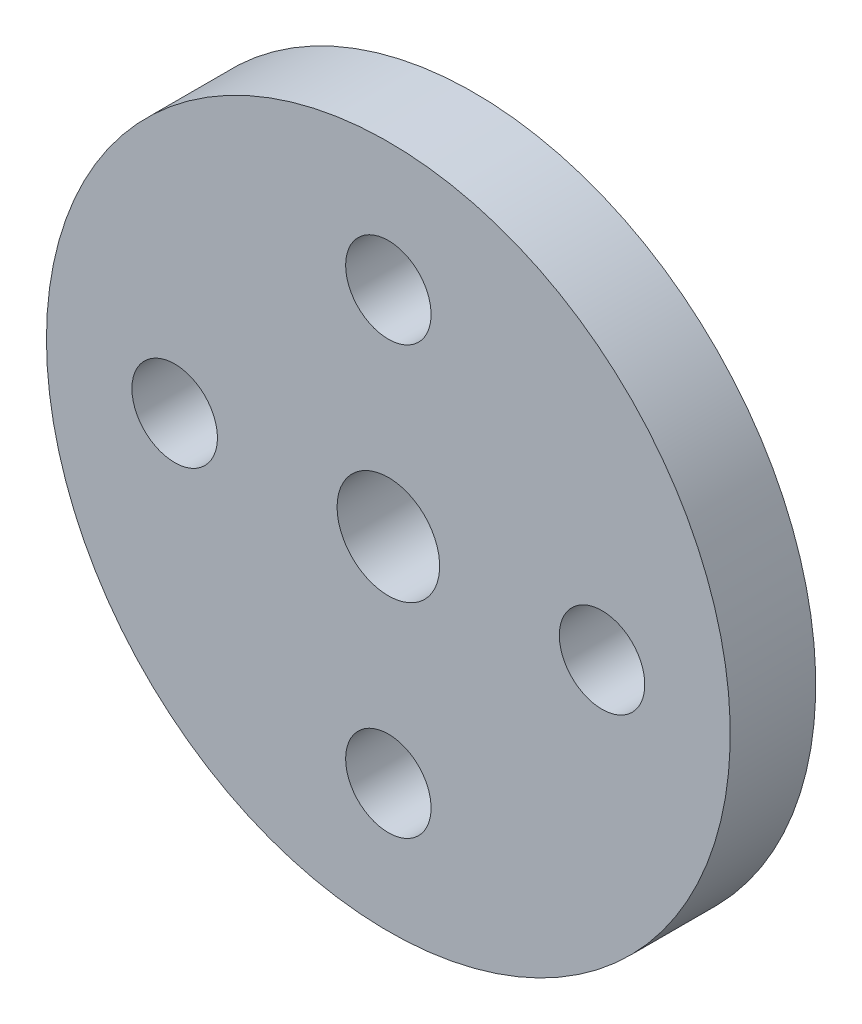
ISO-10303-21;
HEADER;
FILE_DESCRIPTION(('STEP AP214'),'2;1');
FILE_NAME('part.step','',(''),(''),'','','');
FILE_SCHEMA(('AUTOMOTIVE_DESIGN { 1 0 10303 214 1 1 1 1 }'));
ENDSEC;
DATA;
#1=APPLICATION_CONTEXT('core data for automotive mechanical design processes');
#2=APPLICATION_PROTOCOL_DEFINITION('international standard','automotive_design',2000,#1);
#3=PRODUCT_CONTEXT('',#1,'mechanical');
#4=PRODUCT('Part','Part','',(#3));
#5=PRODUCT_RELATED_PRODUCT_CATEGORY('part','',(#4));
#6=PRODUCT_DEFINITION_FORMATION('','',#4);
#7=PRODUCT_DEFINITION_CONTEXT('part definition',#1,'design');
#8=PRODUCT_DEFINITION('design','',#6,#7);
#9=PRODUCT_DEFINITION_SHAPE('','',#8);
#10=(LENGTH_UNIT() NAMED_UNIT(*) SI_UNIT(.MILLI.,.METRE.));
#11=(NAMED_UNIT(*) PLANE_ANGLE_UNIT() SI_UNIT($,.RADIAN.));
#12=(NAMED_UNIT(*) SI_UNIT($,.STERADIAN.) SOLID_ANGLE_UNIT());
#13=UNCERTAINTY_MEASURE_WITH_UNIT(LENGTH_MEASURE(1.E-05),#10,'distance_accuracy_value','');
#14=(GEOMETRIC_REPRESENTATION_CONTEXT(3) GLOBAL_UNCERTAINTY_ASSIGNED_CONTEXT((#13)) GLOBAL_UNIT_ASSIGNED_CONTEXT((#10,
#11,#12)) REPRESENTATION_CONTEXT('',''));
#15=CARTESIAN_POINT('',(0.,0.,0.));
#16=DIRECTION('',(0.,0.,1.));
#17=DIRECTION('',(1.,0.,0.));
#18=AXIS2_PLACEMENT_3D('',#15,#16,#17);
#19=CARTESIAN_POINT('',(0.,0.,0.));
#20=DIRECTION('',(0.,0.,1.));
#21=DIRECTION('',(1.,0.,0.));
#22=AXIS2_PLACEMENT_3D('',#19,#20,#21);
#23=PLANE('',#22);
#24=DIRECTION('',(0.,1.,0.));
#25=VECTOR('',#24,1.);
#26=CARTESIAN_POINT('',(3.,1.5,0.));
#27=LINE('',#26,#25);
#28=CARTESIAN_POINT('',(3.,0.,0.));
#29=VERTEX_POINT('',#28);
#30=CARTESIAN_POINT('',(3.,3.,0.));
#31=VERTEX_POINT('',#30);
#32=EDGE_CURVE('E326',#29,#31,#27,.T.);
#33=ORIENTED_EDGE('',*,*,#32,.T.);
#34=DIRECTION('',(1.,0.,0.));
#35=VECTOR('',#34,1.);
#36=CARTESIAN_POINT('',(2.15421099245176,3.,0.));
#37=LINE('',#36,#35);
#38=CARTESIAN_POINT('',(4.30842198490352,3.,0.));
#39=VERTEX_POINT('',#38);
#40=EDGE_CURVE('E259',#31,#39,#37,.T.);
#41=ORIENTED_EDGE('',*,*,#40,.T.);
#42=CARTESIAN_POINT('',(0.,0.,0.));
#43=DIRECTION('',(0.,0.,1.));
#44=DIRECTION('',(1.,0.,0.));
#45=AXIS2_PLACEMENT_3D('',#42,#43,#44);
#46=CIRCLE('',#45,5.25);
#47=CARTESIAN_POINT('',(-4.30842198490352,3.,0.));
#48=VERTEX_POINT('',#47);
#49=EDGE_CURVE('E294',#39,#48,#46,.T.);
#50=ORIENTED_EDGE('',*,*,#49,.T.);
#51=DIRECTION('',(1.,0.,0.));
#52=VECTOR('',#51,1.);
#53=CARTESIAN_POINT('',(-1.5,3.,0.));
#54=LINE('',#53,#52);
#55=CARTESIAN_POINT('',(-3.,3.,0.));
#56=VERTEX_POINT('',#55);
#57=EDGE_CURVE('E313',#48,#56,#54,.T.);
#58=ORIENTED_EDGE('',*,*,#57,.T.);
#59=DIRECTION('',(0.,-1.,0.));
#60=VECTOR('',#59,1.);
#61=CARTESIAN_POINT('',(-3.,0.,0.));
#62=LINE('',#61,#60);
#63=CARTESIAN_POINT('',(-3.,0.,0.));
#64=VERTEX_POINT('',#63);
#65=EDGE_CURVE('E250',#56,#64,#62,.T.);
#66=ORIENTED_EDGE('',*,*,#65,.T.);
#67=DIRECTION('',(0.,-1.,0.));
#68=VECTOR('',#67,1.);
#69=CARTESIAN_POINT('',(-3.,-1.5,0.));
#70=LINE('',#69,#68);
#71=CARTESIAN_POINT('',(-3.,-3.,0.));
#72=VERTEX_POINT('',#71);
#73=EDGE_CURVE('E212',#64,#72,#70,.T.);
#74=ORIENTED_EDGE('',*,*,#73,.T.);
#75=DIRECTION('',(-1.,0.,0.));
#76=VECTOR('',#75,1.);
#77=CARTESIAN_POINT('',(-2.15421099245176,-3.,0.));
#78=LINE('',#77,#76);
#79=CARTESIAN_POINT('',(-4.30842198490352,-3.,0.));
#80=VERTEX_POINT('',#79);
#81=EDGE_CURVE('E237',#72,#80,#78,.T.);
#82=ORIENTED_EDGE('',*,*,#81,.T.);
#83=CARTESIAN_POINT('',(0.,0.,0.));
#84=DIRECTION('',(0.,0.,1.));
#85=DIRECTION('',(1.,0.,0.));
#86=AXIS2_PLACEMENT_3D('',#83,#84,#85);
#87=CIRCLE('',#86,5.25);
#88=CARTESIAN_POINT('',(4.30842198490352,-3.,0.));
#89=VERTEX_POINT('',#88);
#90=EDGE_CURVE('E255',#80,#89,#87,.T.);
#91=ORIENTED_EDGE('',*,*,#90,.T.);
#92=DIRECTION('',(-1.,0.,0.));
#93=VECTOR('',#92,1.);
#94=CARTESIAN_POINT('',(1.5,-3.,0.));
#95=LINE('',#94,#93);
#96=CARTESIAN_POINT('',(3.,-3.,0.));
#97=VERTEX_POINT('',#96);
#98=EDGE_CURVE('E269',#89,#97,#95,.T.);
#99=ORIENTED_EDGE('',*,*,#98,.T.);
#100=DIRECTION('',(0.,1.,0.));
#101=VECTOR('',#100,1.);
#102=CARTESIAN_POINT('',(3.,0.,0.));
#103=LINE('',#102,#101);
#104=EDGE_CURVE('E281',#97,#29,#103,.T.);
#105=ORIENTED_EDGE('',*,*,#104,.T.);
#106=EDGE_LOOP('',(#33,#41,#50,#58,#66,#74,#82,#91,#99,#105));
#107=FACE_BOUND('',#106,.T.);
#108=CARTESIAN_POINT('',(-12.5,0.,0.));
#109=DIRECTION('',(0.,0.,1.));
#110=DIRECTION('',(1.,0.,0.));
#111=AXIS2_PLACEMENT_3D('',#108,#109,#110);
#112=CIRCLE('',#111,2.5);
#113=CARTESIAN_POINT('',(-15.,0.,0.));
#114=VERTEX_POINT('',#113);
#115=EDGE_CURVE('E211',#114,#114,#112,.T.);
#116=ORIENTED_EDGE('',*,*,#115,.T.);
#117=EDGE_LOOP('',(#116));
#118=FACE_BOUND('',#117,.T.);
#119=CARTESIAN_POINT('',(0.,-12.5,0.));
#120=DIRECTION('',(0.,0.,1.));
#121=DIRECTION('',(1.,0.,0.));
#122=AXIS2_PLACEMENT_3D('',#119,#120,#121);
#123=CIRCLE('',#122,2.5);
#124=CARTESIAN_POINT('',(-2.5,-12.5,0.));
#125=VERTEX_POINT('',#124);
#126=EDGE_CURVE('E219',#125,#125,#123,.T.);
#127=ORIENTED_EDGE('',*,*,#126,.T.);
#128=EDGE_LOOP('',(#127));
#129=FACE_BOUND('',#128,.T.);
#130=CARTESIAN_POINT('',(0.,12.5,0.));
#131=DIRECTION('',(0.,0.,1.));
#132=DIRECTION('',(1.,0.,0.));
#133=AXIS2_PLACEMENT_3D('',#130,#131,#132);
#134=CIRCLE('',#133,2.5);
#135=CARTESIAN_POINT('',(-2.5,12.5,0.));
#136=VERTEX_POINT('',#135);
#137=EDGE_CURVE('E210',#136,#136,#134,.T.);
#138=ORIENTED_EDGE('',*,*,#137,.T.);
#139=EDGE_LOOP('',(#138));
#140=FACE_BOUND('',#139,.T.);
#141=CARTESIAN_POINT('',(12.5,0.,0.));
#142=DIRECTION('',(0.,0.,1.));
#143=DIRECTION('',(1.,0.,0.));
#144=AXIS2_PLACEMENT_3D('',#141,#142,#143);
#145=CIRCLE('',#144,2.5);
#146=CARTESIAN_POINT('',(10.,0.,0.));
#147=VERTEX_POINT('',#146);
#148=EDGE_CURVE('E178',#147,#147,#145,.T.);
#149=ORIENTED_EDGE('',*,*,#148,.T.);
#150=EDGE_LOOP('',(#149));
#151=FACE_BOUND('',#150,.T.);
#152=CARTESIAN_POINT('',(0.,0.,0.));
#153=DIRECTION('',(0.,0.,1.));
#154=DIRECTION('',(1.,0.,0.));
#155=AXIS2_PLACEMENT_3D('',#152,#153,#154);
#156=CIRCLE('',#155,20.);
#157=CARTESIAN_POINT('',(-20.,0.,0.));
#158=VERTEX_POINT('',#157);
#159=EDGE_CURVE('E11',#158,#158,#156,.T.);
#160=ORIENTED_EDGE('',*,*,#159,.F.);
#161=EDGE_LOOP('',(#160));
#162=FACE_BOUND('',#161,.T.);
#163=ADVANCED_FACE('F17',(#107,#118,#129,#140,#151,#162),#23,.F.);
#164=CARTESIAN_POINT('',(0.,0.,5.));
#165=DIRECTION('',(0.,0.,1.));
#166=DIRECTION('',(1.,0.,0.));
#167=AXIS2_PLACEMENT_3D('',#164,#165,#166);
#168=PLANE('',#167);
#169=CARTESIAN_POINT('',(0.,0.,5.));
#170=DIRECTION('',(0.,0.,-1.));
#171=DIRECTION('',(-1.,0.,0.));
#172=AXIS2_PLACEMENT_3D('',#169,#170,#171);
#173=CIRCLE('',#172,3.);
#174=CARTESIAN_POINT('',(-3.,0.,5.));
#175=VERTEX_POINT('',#174);
#176=EDGE_CURVE('E342',#175,#175,#173,.T.);
#177=ORIENTED_EDGE('',*,*,#176,.T.);
#178=EDGE_LOOP('',(#177));
#179=FACE_BOUND('',#178,.T.);
#180=CARTESIAN_POINT('',(-12.5,0.,5.));
#181=DIRECTION('',(0.,0.,-1.));
#182=DIRECTION('',(1.,0.,0.));
#183=AXIS2_PLACEMENT_3D('',#180,#181,#182);
#184=CIRCLE('',#183,2.5);
#185=CARTESIAN_POINT('',(-15.,0.,5.));
#186=VERTEX_POINT('',#185);
#187=EDGE_CURVE('E226',#186,#186,#184,.T.);
#188=ORIENTED_EDGE('',*,*,#187,.T.);
#189=EDGE_LOOP('',(#188));
#190=FACE_BOUND('',#189,.T.);
#191=CARTESIAN_POINT('',(0.,-12.5,5.));
#192=DIRECTION('',(0.,0.,-1.));
#193=DIRECTION('',(1.,0.,0.));
#194=AXIS2_PLACEMENT_3D('',#191,#192,#193);
#195=CIRCLE('',#194,2.5);
#196=CARTESIAN_POINT('',(-2.5,-12.5,5.));
#197=VERTEX_POINT('',#196);
#198=EDGE_CURVE('E209',#197,#197,#195,.T.);
#199=ORIENTED_EDGE('',*,*,#198,.T.);
#200=EDGE_LOOP('',(#199));
#201=FACE_BOUND('',#200,.T.);
#202=CARTESIAN_POINT('',(0.,12.5,5.));
#203=DIRECTION('',(0.,0.,-1.));
#204=DIRECTION('',(1.,0.,0.));
#205=AXIS2_PLACEMENT_3D('',#202,#203,#204);
#206=CIRCLE('',#205,2.5);
#207=CARTESIAN_POINT('',(-2.5,12.5,5.));
#208=VERTEX_POINT('',#207);
#209=EDGE_CURVE('E194',#208,#208,#206,.T.);
#210=ORIENTED_EDGE('',*,*,#209,.T.);
#211=EDGE_LOOP('',(#210));
#212=FACE_BOUND('',#211,.T.);
#213=CARTESIAN_POINT('',(12.5,0.,5.));
#214=DIRECTION('',(0.,0.,-1.));
#215=DIRECTION('',(1.,0.,0.));
#216=AXIS2_PLACEMENT_3D('',#213,#214,#215);
#217=CIRCLE('',#216,2.5);
#218=CARTESIAN_POINT('',(10.,0.,5.));
#219=VERTEX_POINT('',#218);
#220=EDGE_CURVE('E180',#219,#219,#217,.T.);
#221=ORIENTED_EDGE('',*,*,#220,.T.);
#222=EDGE_LOOP('',(#221));
#223=FACE_BOUND('',#222,.T.);
#224=CARTESIAN_POINT('',(0.,0.,5.));
#225=DIRECTION('',(0.,0.,1.));
#226=DIRECTION('',(1.,0.,0.));
#227=AXIS2_PLACEMENT_3D('',#224,#225,#226);
#228=CIRCLE('',#227,20.);
#229=CARTESIAN_POINT('',(-20.,0.,5.));
#230=VERTEX_POINT('',#229);
#231=EDGE_CURVE('E351',#230,#230,#228,.T.);
#232=ORIENTED_EDGE('',*,*,#231,.T.);
#233=EDGE_LOOP('',(#232));
#234=FACE_BOUND('',#233,.T.);
#235=ADVANCED_FACE('F181',(#179,#190,#201,#212,#223,#234),#168,.T.);
#236=CARTESIAN_POINT('',(0.,0.,0.));
#237=DIRECTION('',(0.,0.,1.));
#238=DIRECTION('',(1.,0.,0.));
#239=AXIS2_PLACEMENT_3D('',#236,#237,#238);
#240=CYLINDRICAL_SURFACE('',#239,20.);
#241=ORIENTED_EDGE('',*,*,#231,.F.);
#242=DIRECTION('',(0.,0.,-1.));
#243=VECTOR('',#242,1.);
#244=CARTESIAN_POINT('',(-20.,0.,0.));
#245=LINE('',#244,#243);
#246=EDGE_CURVE('E25',#230,#158,#245,.T.);
#247=ORIENTED_EDGE('',*,*,#246,.T.);
#248=ORIENTED_EDGE('',*,*,#159,.T.);
#249=ORIENTED_EDGE('',*,*,#246,.F.);
#250=EDGE_LOOP('',(#241,#247,#248,#249));
#251=FACE_BOUND('',#250,.T.);
#252=ADVANCED_FACE('F358',(#251),#240,.T.);
#253=CARTESIAN_POINT('',(0.,0.,0.));
#254=DIRECTION('',(0.,0.,1.));
#255=DIRECTION('',(1.,0.,0.));
#256=AXIS2_PLACEMENT_3D('',#253,#254,#255);
#257=CYLINDRICAL_SURFACE('',#256,3.);
#258=ORIENTED_EDGE('',*,*,#176,.F.);
#259=DIRECTION('',(0.,0.,-1.));
#260=VECTOR('',#259,1.);
#261=CARTESIAN_POINT('',(-3.,0.,0.));
#262=LINE('',#261,#260);
#263=EDGE_CURVE('E348',#175,#64,#262,.T.);
#264=ORIENTED_EDGE('',*,*,#263,.T.);
#265=DIRECTION('',(0.,0.,-1.));
#266=VECTOR('',#265,1.);
#267=CARTESIAN_POINT('',(-3.,0.,0.));
#268=LINE('',#267,#266);
#269=CARTESIAN_POINT('',(-3.,0.,-5.));
#270=VERTEX_POINT('',#269);
#271=EDGE_CURVE('E247',#64,#270,#268,.T.);
#272=ORIENTED_EDGE('',*,*,#271,.T.);
#273=CARTESIAN_POINT('',(0.,0.,-5.));
#274=DIRECTION('',(0.,0.,1.));
#275=DIRECTION('',(-1.,0.,0.));
#276=AXIS2_PLACEMENT_3D('',#273,#274,#275);
#277=CIRCLE('',#276,3.);
#278=CARTESIAN_POINT('',(3.,0.,-5.));
#279=VERTEX_POINT('',#278);
#280=EDGE_CURVE('E256',#279,#270,#277,.T.);
#281=ORIENTED_EDGE('',*,*,#280,.F.);
#282=DIRECTION('',(0.,0.,-1.));
#283=VECTOR('',#282,1.);
#284=CARTESIAN_POINT('',(3.,0.,0.));
#285=LINE('',#284,#283);
#286=EDGE_CURVE('E50',#29,#279,#285,.T.);
#287=ORIENTED_EDGE('',*,*,#286,.F.);
#288=DIRECTION('',(0.,0.,-1.));
#289=VECTOR('',#288,1.);
#290=CARTESIAN_POINT('',(3.,0.,0.));
#291=LINE('',#290,#289);
#292=CARTESIAN_POINT('',(3.,0.,-5.));
#293=VERTEX_POINT('',#292);
#294=EDGE_CURVE('E288',#29,#293,#291,.T.);
#295=ORIENTED_EDGE('',*,*,#294,.T.);
#296=CARTESIAN_POINT('',(0.,0.,-5.));
#297=DIRECTION('',(0.,0.,1.));
#298=DIRECTION('',(-1.,0.,0.));
#299=AXIS2_PLACEMENT_3D('',#296,#297,#298);
#300=CIRCLE('',#299,3.);
#301=CARTESIAN_POINT('',(-3.,0.,-5.));
#302=VERTEX_POINT('',#301);
#303=EDGE_CURVE('E291',#302,#293,#300,.T.);
#304=ORIENTED_EDGE('',*,*,#303,.F.);
#305=DIRECTION('',(0.,0.,-1.));
#306=VECTOR('',#305,1.);
#307=CARTESIAN_POINT('',(-3.,0.,0.));
#308=LINE('',#307,#306);
#309=EDGE_CURVE('E200',#64,#302,#308,.T.);
#310=ORIENTED_EDGE('',*,*,#309,.F.);
#311=ORIENTED_EDGE('',*,*,#263,.F.);
#312=EDGE_LOOP('',(#258,#264,#272,#281,#287,#295,#304,#310,#311));
#313=FACE_BOUND('',#312,.T.);
#314=ADVANCED_FACE('F367',(#313),#257,.F.);
#315=CARTESIAN_POINT('',(0.,2.625,-5.));
#316=DIRECTION('',(0.,0.,1.));
#317=DIRECTION('',(1.,0.,0.));
#318=AXIS2_PLACEMENT_3D('',#315,#316,#317);
#319=PLANE('',#318);
#320=DIRECTION('',(-1.,0.,0.));
#321=VECTOR('',#320,1.);
#322=CARTESIAN_POINT('',(-4.30842198490352,3.,-5.));
#323=LINE('',#322,#321);
#324=CARTESIAN_POINT('',(4.30842198490352,3.,-5.));
#325=VERTEX_POINT('',#324);
#326=CARTESIAN_POINT('',(3.,3.,-5.));
#327=VERTEX_POINT('',#326);
#328=EDGE_CURVE('E254',#325,#327,#323,.T.);
#329=ORIENTED_EDGE('',*,*,#328,.T.);
#330=DIRECTION('',(0.,-1.,0.));
#331=VECTOR('',#330,1.);
#332=CARTESIAN_POINT('',(3.,-4.30842198490352,-5.));
#333=LINE('',#332,#331);
#334=EDGE_CURVE('E335',#327,#279,#333,.T.);
#335=ORIENTED_EDGE('',*,*,#334,.T.);
#336=ORIENTED_EDGE('',*,*,#280,.T.);
#337=DIRECTION('',(0.,1.,0.));
#338=VECTOR('',#337,1.);
#339=CARTESIAN_POINT('',(-3.,4.30842198490352,-5.));
#340=LINE('',#339,#338);
#341=CARTESIAN_POINT('',(-3.,3.,-5.));
#342=VERTEX_POINT('',#341);
#343=EDGE_CURVE('E40',#270,#342,#340,.T.);
#344=ORIENTED_EDGE('',*,*,#343,.T.);
#345=DIRECTION('',(-1.,0.,0.));
#346=VECTOR('',#345,1.);
#347=CARTESIAN_POINT('',(-4.30842198490352,3.,-5.));
#348=LINE('',#347,#346);
#349=CARTESIAN_POINT('',(-4.30842198490352,3.,-5.));
#350=VERTEX_POINT('',#349);
#351=EDGE_CURVE('E312',#342,#350,#348,.T.);
#352=ORIENTED_EDGE('',*,*,#351,.T.);
#353=CARTESIAN_POINT('',(0.,0.,-5.));
#354=DIRECTION('',(0.,0.,-1.));
#355=DIRECTION('',(1.,0.,0.));
#356=AXIS2_PLACEMENT_3D('',#353,#354,#355);
#357=CIRCLE('',#356,5.25);
#358=EDGE_CURVE('E304',#350,#325,#357,.T.);
#359=ORIENTED_EDGE('',*,*,#358,.T.);
#360=EDGE_LOOP('',(#329,#335,#336,#344,#352,#359));
#361=FACE_BOUND('',#360,.T.);
#362=ADVANCED_FACE('F384',(#361),#319,.F.);
#363=CARTESIAN_POINT('',(4.30842198490352,3.,0.));
#364=DIRECTION('',(0.,-1.,0.));
#365=DIRECTION('',(0.,0.,-1.));
#366=AXIS2_PLACEMENT_3D('',#363,#364,#365);
#367=PLANE('',#366);
#368=ORIENTED_EDGE('',*,*,#40,.F.);
#369=DIRECTION('',(0.,0.,-1.));
#370=VECTOR('',#369,1.);
#371=CARTESIAN_POINT('',(3.,3.,0.));
#372=LINE('',#371,#370);
#373=EDGE_CURVE('E333',#31,#327,#372,.T.);
#374=ORIENTED_EDGE('',*,*,#373,.T.);
#375=ORIENTED_EDGE('',*,*,#328,.F.);
#376=DIRECTION('',(0.,0.,-1.));
#377=VECTOR('',#376,1.);
#378=CARTESIAN_POINT('',(4.30842198490352,3.,0.));
#379=LINE('',#378,#377);
#380=EDGE_CURVE('E298',#39,#325,#379,.T.);
#381=ORIENTED_EDGE('',*,*,#380,.F.);
#382=EDGE_LOOP('',(#368,#374,#375,#381));
#383=FACE_BOUND('',#382,.T.);
#384=ADVANCED_FACE('F419',(#383),#367,.T.);
#385=CARTESIAN_POINT('',(3.,3.,0.));
#386=DIRECTION('',(1.,0.,0.));
#387=DIRECTION('',(0.,1.,0.));
#388=AXIS2_PLACEMENT_3D('',#385,#386,#387);
#389=PLANE('',#388);
#390=ORIENTED_EDGE('',*,*,#32,.F.);
#391=ORIENTED_EDGE('',*,*,#286,.T.);
#392=ORIENTED_EDGE('',*,*,#334,.F.);
#393=ORIENTED_EDGE('',*,*,#373,.F.);
#394=EDGE_LOOP('',(#390,#391,#392,#393));
#395=FACE_BOUND('',#394,.T.);
#396=ADVANCED_FACE('F417',(#395),#389,.T.);
#397=CARTESIAN_POINT('',(-3.,0.,0.));
#398=DIRECTION('',(-1.,0.,0.));
#399=DIRECTION('',(0.,0.,1.));
#400=AXIS2_PLACEMENT_3D('',#397,#398,#399);
#401=PLANE('',#400);
#402=ORIENTED_EDGE('',*,*,#65,.F.);
#403=DIRECTION('',(0.,0.,-1.));
#404=VECTOR('',#403,1.);
#405=CARTESIAN_POINT('',(-3.,3.,0.));
#406=LINE('',#405,#404);
#407=EDGE_CURVE('E318',#56,#342,#406,.T.);
#408=ORIENTED_EDGE('',*,*,#407,.T.);
#409=ORIENTED_EDGE('',*,*,#343,.F.);
#410=ORIENTED_EDGE('',*,*,#271,.F.);
#411=EDGE_LOOP('',(#402,#408,#409,#410));
#412=FACE_BOUND('',#411,.T.);
#413=ADVANCED_FACE('F409',(#412),#401,.T.);
#414=CARTESIAN_POINT('',(-3.,3.,0.));
#415=DIRECTION('',(0.,-1.,0.));
#416=DIRECTION('',(0.,0.,-1.));
#417=AXIS2_PLACEMENT_3D('',#414,#415,#416);
#418=PLANE('',#417);
#419=ORIENTED_EDGE('',*,*,#57,.F.);
#420=DIRECTION('',(0.,0.,-1.));
#421=VECTOR('',#420,1.);
#422=CARTESIAN_POINT('',(-4.30842198490352,3.,0.));
#423=LINE('',#422,#421);
#424=EDGE_CURVE('E307',#48,#350,#423,.T.);
#425=ORIENTED_EDGE('',*,*,#424,.T.);
#426=ORIENTED_EDGE('',*,*,#351,.F.);
#427=ORIENTED_EDGE('',*,*,#407,.F.);
#428=EDGE_LOOP('',(#419,#425,#426,#427));
#429=FACE_BOUND('',#428,.T.);
#430=ADVANCED_FACE('F406',(#429),#418,.T.);
#431=CARTESIAN_POINT('',(0.,0.,0.));
#432=DIRECTION('',(0.,0.,-1.));
#433=DIRECTION('',(1.,0.,0.));
#434=AXIS2_PLACEMENT_3D('',#431,#432,#433);
#435=CYLINDRICAL_SURFACE('',#434,5.25);
#436=ORIENTED_EDGE('',*,*,#49,.F.);
#437=ORIENTED_EDGE('',*,*,#380,.T.);
#438=ORIENTED_EDGE('',*,*,#358,.F.);
#439=ORIENTED_EDGE('',*,*,#424,.F.);
#440=EDGE_LOOP('',(#436,#437,#438,#439));
#441=FACE_BOUND('',#440,.T.);
#442=ADVANCED_FACE('F408',(#441),#435,.T.);
#443=CARTESIAN_POINT('',(0.,-2.625,-5.));
#444=DIRECTION('',(0.,0.,1.));
#445=DIRECTION('',(1.,0.,0.));
#446=AXIS2_PLACEMENT_3D('',#443,#444,#445);
#447=PLANE('',#446);
#448=ORIENTED_EDGE('',*,*,#303,.T.);
#449=DIRECTION('',(0.,-1.,0.));
#450=VECTOR('',#449,1.);
#451=CARTESIAN_POINT('',(3.,-4.30842198490352,-5.));
#452=LINE('',#451,#450);
#453=CARTESIAN_POINT('',(3.,-3.,-5.));
#454=VERTEX_POINT('',#453);
#455=EDGE_CURVE('E285',#293,#454,#452,.T.);
#456=ORIENTED_EDGE('',*,*,#455,.T.);
#457=DIRECTION('',(1.,0.,0.));
#458=VECTOR('',#457,1.);
#459=CARTESIAN_POINT('',(4.30842198490352,-3.,-5.));
#460=LINE('',#459,#458);
#461=CARTESIAN_POINT('',(4.30842198490352,-3.,-5.));
#462=VERTEX_POINT('',#461);
#463=EDGE_CURVE('E273',#454,#462,#460,.T.);
#464=ORIENTED_EDGE('',*,*,#463,.T.);
#465=CARTESIAN_POINT('',(0.,0.,-5.));
#466=DIRECTION('',(0.,0.,-1.));
#467=DIRECTION('',(1.,0.,0.));
#468=AXIS2_PLACEMENT_3D('',#465,#466,#467);
#469=CIRCLE('',#468,5.25);
#470=CARTESIAN_POINT('',(-4.30842198490352,-3.,-5.));
#471=VERTEX_POINT('',#470);
#472=EDGE_CURVE('E263',#462,#471,#469,.T.);
#473=ORIENTED_EDGE('',*,*,#472,.T.);
#474=DIRECTION('',(1.,0.,0.));
#475=VECTOR('',#474,1.);
#476=CARTESIAN_POINT('',(4.30842198490352,-3.,-5.));
#477=LINE('',#476,#475);
#478=CARTESIAN_POINT('',(-3.,-3.,-5.));
#479=VERTEX_POINT('',#478);
#480=EDGE_CURVE('E242',#471,#479,#477,.T.);
#481=ORIENTED_EDGE('',*,*,#480,.T.);
#482=DIRECTION('',(0.,1.,0.));
#483=VECTOR('',#482,1.);
#484=CARTESIAN_POINT('',(-3.,4.30842198490352,-5.));
#485=LINE('',#484,#483);
#486=EDGE_CURVE('E193',#479,#302,#485,.T.);
#487=ORIENTED_EDGE('',*,*,#486,.T.);
#488=EDGE_LOOP('',(#448,#456,#464,#473,#481,#487));
#489=FACE_BOUND('',#488,.T.);
#490=ADVANCED_FACE('F374',(#489),#447,.F.);
#491=CARTESIAN_POINT('',(3.,0.,0.));
#492=DIRECTION('',(1.,0.,0.));
#493=DIRECTION('',(0.,1.,0.));
#494=AXIS2_PLACEMENT_3D('',#491,#492,#493);
#495=PLANE('',#494);
#496=ORIENTED_EDGE('',*,*,#104,.F.);
#497=DIRECTION('',(0.,0.,-1.));
#498=VECTOR('',#497,1.);
#499=CARTESIAN_POINT('',(3.,-3.,0.));
#500=LINE('',#499,#498);
#501=EDGE_CURVE('E280',#97,#454,#500,.T.);
#502=ORIENTED_EDGE('',*,*,#501,.T.);
#503=ORIENTED_EDGE('',*,*,#455,.F.);
#504=ORIENTED_EDGE('',*,*,#294,.F.);
#505=EDGE_LOOP('',(#496,#502,#503,#504));
#506=FACE_BOUND('',#505,.T.);
#507=ADVANCED_FACE('F405',(#506),#495,.T.);
#508=CARTESIAN_POINT('',(3.,-3.,0.));
#509=DIRECTION('',(0.,1.,0.));
#510=DIRECTION('',(1.,0.,0.));
#511=AXIS2_PLACEMENT_3D('',#508,#509,#510);
#512=PLANE('',#511);
#513=ORIENTED_EDGE('',*,*,#98,.F.);
#514=DIRECTION('',(0.,0.,-1.));
#515=VECTOR('',#514,1.);
#516=CARTESIAN_POINT('',(4.30842198490352,-3.,0.));
#517=LINE('',#516,#515);
#518=EDGE_CURVE('E266',#89,#462,#517,.T.);
#519=ORIENTED_EDGE('',*,*,#518,.T.);
#520=ORIENTED_EDGE('',*,*,#463,.F.);
#521=ORIENTED_EDGE('',*,*,#501,.F.);
#522=EDGE_LOOP('',(#513,#519,#520,#521));
#523=FACE_BOUND('',#522,.T.);
#524=ADVANCED_FACE('F400',(#523),#512,.T.);
#525=CARTESIAN_POINT('',(0.,0.,0.));
#526=DIRECTION('',(0.,0.,-1.));
#527=DIRECTION('',(1.,0.,0.));
#528=AXIS2_PLACEMENT_3D('',#525,#526,#527);
#529=CYLINDRICAL_SURFACE('',#528,5.25);
#530=ORIENTED_EDGE('',*,*,#90,.F.);
#531=DIRECTION('',(0.,0.,-1.));
#532=VECTOR('',#531,1.);
#533=CARTESIAN_POINT('',(-4.30842198490352,-3.,0.));
#534=LINE('',#533,#532);
#535=EDGE_CURVE('E248',#80,#471,#534,.T.);
#536=ORIENTED_EDGE('',*,*,#535,.T.);
#537=ORIENTED_EDGE('',*,*,#472,.F.);
#538=ORIENTED_EDGE('',*,*,#518,.F.);
#539=EDGE_LOOP('',(#530,#536,#537,#538));
#540=FACE_BOUND('',#539,.T.);
#541=ADVANCED_FACE('F394',(#540),#529,.T.);
#542=CARTESIAN_POINT('',(-4.30842198490352,-3.,0.));
#543=DIRECTION('',(0.,1.,0.));
#544=DIRECTION('',(1.,0.,0.));
#545=AXIS2_PLACEMENT_3D('',#542,#543,#544);
#546=PLANE('',#545);
#547=ORIENTED_EDGE('',*,*,#81,.F.);
#548=DIRECTION('',(0.,0.,-1.));
#549=VECTOR('',#548,1.);
#550=CARTESIAN_POINT('',(-3.,-3.,0.));
#551=LINE('',#550,#549);
#552=EDGE_CURVE('E192',#72,#479,#551,.T.);
#553=ORIENTED_EDGE('',*,*,#552,.T.);
#554=ORIENTED_EDGE('',*,*,#480,.F.);
#555=ORIENTED_EDGE('',*,*,#535,.F.);
#556=EDGE_LOOP('',(#547,#553,#554,#555));
#557=FACE_BOUND('',#556,.T.);
#558=ADVANCED_FACE('F381',(#557),#546,.T.);
#559=CARTESIAN_POINT('',(-3.,-3.,0.));
#560=DIRECTION('',(-1.,0.,0.));
#561=DIRECTION('',(0.,0.,1.));
#562=AXIS2_PLACEMENT_3D('',#559,#560,#561);
#563=PLANE('',#562);
#564=ORIENTED_EDGE('',*,*,#73,.F.);
#565=ORIENTED_EDGE('',*,*,#309,.T.);
#566=ORIENTED_EDGE('',*,*,#486,.F.);
#567=ORIENTED_EDGE('',*,*,#552,.F.);
#568=EDGE_LOOP('',(#564,#565,#566,#567));
#569=FACE_BOUND('',#568,.T.);
#570=ADVANCED_FACE('F380',(#569),#563,.T.);
#571=CARTESIAN_POINT('',(-12.5,0.,5.));
#572=DIRECTION('',(0.,0.,-1.));
#573=DIRECTION('',(1.,0.,0.));
#574=AXIS2_PLACEMENT_3D('',#571,#572,#573);
#575=CYLINDRICAL_SURFACE('',#574,2.5);
#576=ORIENTED_EDGE('',*,*,#187,.F.);
#577=DIRECTION('',(0.,0.,-1.));
#578=VECTOR('',#577,1.);
#579=CARTESIAN_POINT('',(-15.,0.,5.));
#580=LINE('',#579,#578);
#581=EDGE_CURVE('E214',#186,#114,#580,.T.);
#582=ORIENTED_EDGE('',*,*,#581,.T.);
#583=ORIENTED_EDGE('',*,*,#115,.F.);
#584=ORIENTED_EDGE('',*,*,#581,.F.);
#585=EDGE_LOOP('',(#576,#582,#583,#584));
#586=FACE_BOUND('',#585,.T.);
#587=ADVANCED_FACE('F379',(#586),#575,.F.);
#588=CARTESIAN_POINT('',(0.,-12.5,5.));
#589=DIRECTION('',(0.,0.,-1.));
#590=DIRECTION('',(1.,0.,0.));
#591=AXIS2_PLACEMENT_3D('',#588,#589,#590);
#592=CYLINDRICAL_SURFACE('',#591,2.5);
#593=ORIENTED_EDGE('',*,*,#198,.F.);
#594=DIRECTION('',(0.,0.,-1.));
#595=VECTOR('',#594,1.);
#596=CARTESIAN_POINT('',(-2.5,-12.5,5.));
#597=LINE('',#596,#595);
#598=EDGE_CURVE('E216',#197,#125,#597,.T.);
#599=ORIENTED_EDGE('',*,*,#598,.T.);
#600=ORIENTED_EDGE('',*,*,#126,.F.);
#601=ORIENTED_EDGE('',*,*,#598,.F.);
#602=EDGE_LOOP('',(#593,#599,#600,#601));
#603=FACE_BOUND('',#602,.T.);
#604=ADVANCED_FACE('F386',(#603),#592,.F.);
#605=CARTESIAN_POINT('',(0.,12.5,5.));
#606=DIRECTION('',(0.,0.,-1.));
#607=DIRECTION('',(1.,0.,0.));
#608=AXIS2_PLACEMENT_3D('',#605,#606,#607);
#609=CYLINDRICAL_SURFACE('',#608,2.5);
#610=ORIENTED_EDGE('',*,*,#209,.F.);
#611=DIRECTION('',(0.,0.,-1.));
#612=VECTOR('',#611,1.);
#613=CARTESIAN_POINT('',(-2.5,12.5,5.));
#614=LINE('',#613,#612);
#615=EDGE_CURVE('E201',#208,#136,#614,.T.);
#616=ORIENTED_EDGE('',*,*,#615,.T.);
#617=ORIENTED_EDGE('',*,*,#137,.F.);
#618=ORIENTED_EDGE('',*,*,#615,.F.);
#619=EDGE_LOOP('',(#610,#616,#617,#618));
#620=FACE_BOUND('',#619,.T.);
#621=ADVANCED_FACE('F612',(#620),#609,.F.);
#622=CARTESIAN_POINT('',(12.5,0.,5.));
#623=DIRECTION('',(0.,0.,-1.));
#624=DIRECTION('',(1.,0.,0.));
#625=AXIS2_PLACEMENT_3D('',#622,#623,#624);
#626=CYLINDRICAL_SURFACE('',#625,2.5);
#627=ORIENTED_EDGE('',*,*,#220,.F.);
#628=DIRECTION('',(0.,0.,-1.));
#629=VECTOR('',#628,1.);
#630=CARTESIAN_POINT('',(10.,0.,5.));
#631=LINE('',#630,#629);
#632=EDGE_CURVE('E173',#219,#147,#631,.T.);
#633=ORIENTED_EDGE('',*,*,#632,.T.);
#634=ORIENTED_EDGE('',*,*,#148,.F.);
#635=ORIENTED_EDGE('',*,*,#632,.F.);
#636=EDGE_LOOP('',(#627,#633,#634,#635));
#637=FACE_BOUND('',#636,.T.);
#638=ADVANCED_FACE('F176',(#637),#626,.F.);
#639=CLOSED_SHELL('',(#163,#235,#252,#314,#362,#384,#396,#413,#430,#442,#490,#507,#524,#541,
#558,#570,#587,#604,#621,#638));
#640=MANIFOLD_SOLID_BREP('B1',#639);
#641=ADVANCED_BREP_SHAPE_REPRESENTATION('',(#18,#640),#14);
#642=SHAPE_DEFINITION_REPRESENTATION(#9,#641);
ENDSEC;
END-ISO-10303-21;
